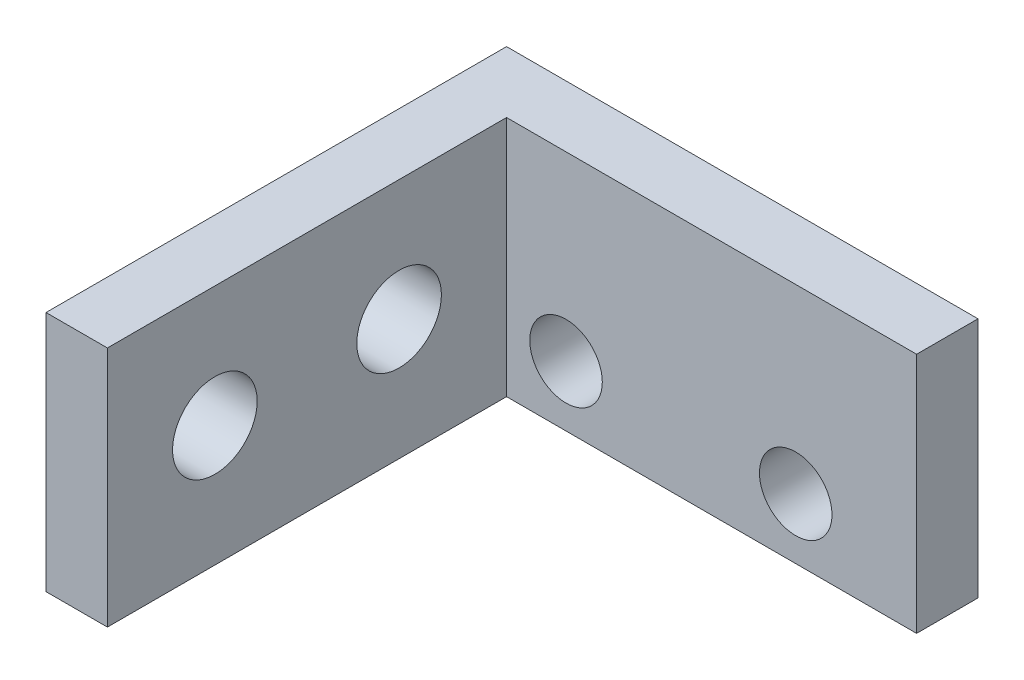
ISO-10303-21;
HEADER;
FILE_DESCRIPTION(('STEP AP214'),'2;1');
FILE_NAME('part.step','',(''),(''),'','','');
FILE_SCHEMA(('AUTOMOTIVE_DESIGN { 1 0 10303 214 1 1 1 1 }'));
ENDSEC;
DATA;
#1=APPLICATION_CONTEXT('core data for automotive mechanical design processes');
#2=APPLICATION_PROTOCOL_DEFINITION('international standard','automotive_design',2000,#1);
#3=PRODUCT_CONTEXT('',#1,'mechanical');
#4=PRODUCT('Part','Part','',(#3));
#5=PRODUCT_RELATED_PRODUCT_CATEGORY('part','',(#4));
#6=PRODUCT_DEFINITION_FORMATION('','',#4);
#7=PRODUCT_DEFINITION_CONTEXT('part definition',#1,'design');
#8=PRODUCT_DEFINITION('design','',#6,#7);
#9=PRODUCT_DEFINITION_SHAPE('','',#8);
#10=(LENGTH_UNIT() NAMED_UNIT(*) SI_UNIT(.MILLI.,.METRE.));
#11=(NAMED_UNIT(*) PLANE_ANGLE_UNIT() SI_UNIT($,.RADIAN.));
#12=(NAMED_UNIT(*) SI_UNIT($,.STERADIAN.) SOLID_ANGLE_UNIT());
#13=UNCERTAINTY_MEASURE_WITH_UNIT(LENGTH_MEASURE(1.E-05),#10,'distance_accuracy_value','');
#14=(GEOMETRIC_REPRESENTATION_CONTEXT(3) GLOBAL_UNCERTAINTY_ASSIGNED_CONTEXT((#13)) GLOBAL_UNIT_ASSIGNED_CONTEXT((#10,
#11,#12)) REPRESENTATION_CONTEXT('',''));
#15=CARTESIAN_POINT('',(0.,0.,0.));
#16=DIRECTION('',(0.,0.,1.));
#17=DIRECTION('',(1.,0.,0.));
#18=AXIS2_PLACEMENT_3D('',#15,#16,#17);
#19=CARTESIAN_POINT('',(0.,0.,1.27));
#20=DIRECTION('',(0.,0.,-1.));
#21=DIRECTION('',(-1.,0.,0.));
#22=AXIS2_PLACEMENT_3D('',#19,#20,#21);
#23=PLANE('',#22);
#24=DIRECTION('',(-1.,0.,0.));
#25=VECTOR('',#24,1.);
#26=CARTESIAN_POINT('',(-9.75,5.,1.27));
#27=LINE('',#26,#25);
#28=CARTESIAN_POINT('',(9.75,5.,1.27));
#29=VERTEX_POINT('',#28);
#30=CARTESIAN_POINT('',(-7.21,5.,1.27));
#31=VERTEX_POINT('',#30);
#32=EDGE_CURVE('E61',#29,#31,#27,.T.);
#33=ORIENTED_EDGE('',*,*,#32,.T.);
#34=DIRECTION('',(0.,-1.,0.));
#35=VECTOR('',#34,1.);
#36=CARTESIAN_POINT('',(-7.21,0.,1.27));
#37=LINE('',#36,#35);
#38=CARTESIAN_POINT('',(-7.21,-5.,1.27));
#39=VERTEX_POINT('',#38);
#40=EDGE_CURVE('E65',#31,#39,#37,.T.);
#41=ORIENTED_EDGE('',*,*,#40,.T.);
#42=DIRECTION('',(1.,0.,0.));
#43=VECTOR('',#42,1.);
#44=CARTESIAN_POINT('',(-9.75,-5.,1.27));
#45=LINE('',#44,#43);
#46=CARTESIAN_POINT('',(9.75,-5.,1.27));
#47=VERTEX_POINT('',#46);
#48=EDGE_CURVE('E104',#39,#47,#45,.T.);
#49=ORIENTED_EDGE('',*,*,#48,.T.);
#50=DIRECTION('',(0.,1.,0.));
#51=VECTOR('',#50,1.);
#52=CARTESIAN_POINT('',(9.75,-5.,1.27));
#53=LINE('',#52,#51);
#54=EDGE_CURVE('E153',#47,#29,#53,.T.);
#55=ORIENTED_EDGE('',*,*,#54,.T.);
#56=EDGE_LOOP('',(#33,#41,#49,#55));
#57=FACE_BOUND('',#56,.T.);
#58=CARTESIAN_POINT('',(-4.75,-2.5,1.27));
#59=DIRECTION('',(0.,0.,1.));
#60=DIRECTION('',(1.,0.,0.));
#61=AXIS2_PLACEMENT_3D('',#58,#59,#60);
#62=CIRCLE('',#61,1.5);
#63=CARTESIAN_POINT('',(-3.25,-2.5,1.27));
#64=VERTEX_POINT('',#63);
#65=EDGE_CURVE('E145',#64,#64,#62,.T.);
#66=ORIENTED_EDGE('',*,*,#65,.F.);
#67=EDGE_LOOP('',(#66));
#68=FACE_BOUND('',#67,.T.);
#69=CARTESIAN_POINT('',(4.75,-2.5,1.27));
#70=DIRECTION('',(0.,0.,1.));
#71=DIRECTION('',(1.,0.,0.));
#72=AXIS2_PLACEMENT_3D('',#69,#70,#71);
#73=CIRCLE('',#72,1.5);
#74=CARTESIAN_POINT('',(6.25,-2.5,1.27));
#75=VERTEX_POINT('',#74);
#76=EDGE_CURVE('E137',#75,#75,#73,.T.);
#77=ORIENTED_EDGE('',*,*,#76,.F.);
#78=EDGE_LOOP('',(#77));
#79=FACE_BOUND('',#78,.T.);
#80=ADVANCED_FACE('F45',(#57,#68,#79),#23,.F.);
#81=CARTESIAN_POINT('',(0.,0.,-1.27));
#82=DIRECTION('',(0.,0.,-1.));
#83=DIRECTION('',(-1.,0.,0.));
#84=AXIS2_PLACEMENT_3D('',#81,#82,#83);
#85=PLANE('',#84);
#86=DIRECTION('',(0.,1.,0.));
#87=VECTOR('',#86,1.);
#88=CARTESIAN_POINT('',(9.75,-5.,-1.27));
#89=LINE('',#88,#87);
#90=CARTESIAN_POINT('',(9.75,-5.,-1.27));
#91=VERTEX_POINT('',#90);
#92=CARTESIAN_POINT('',(9.75,5.,-1.27));
#93=VERTEX_POINT('',#92);
#94=EDGE_CURVE('E149',#91,#93,#89,.T.);
#95=ORIENTED_EDGE('',*,*,#94,.F.);
#96=DIRECTION('',(1.,0.,0.));
#97=VECTOR('',#96,1.);
#98=CARTESIAN_POINT('',(-9.75,-5.,-1.27));
#99=LINE('',#98,#97);
#100=CARTESIAN_POINT('',(-9.75,-5.,-1.27));
#101=VERTEX_POINT('',#100);
#102=EDGE_CURVE('E156',#101,#91,#99,.T.);
#103=ORIENTED_EDGE('',*,*,#102,.F.);
#104=DIRECTION('',(0.,-1.,0.));
#105=VECTOR('',#104,1.);
#106=CARTESIAN_POINT('',(-9.75,-5.,-1.27));
#107=LINE('',#106,#105);
#108=CARTESIAN_POINT('',(-9.75,5.,-1.27));
#109=VERTEX_POINT('',#108);
#110=EDGE_CURVE('E168',#109,#101,#107,.T.);
#111=ORIENTED_EDGE('',*,*,#110,.F.);
#112=DIRECTION('',(-1.,0.,0.));
#113=VECTOR('',#112,1.);
#114=CARTESIAN_POINT('',(-9.75,5.,-1.27));
#115=LINE('',#114,#113);
#116=EDGE_CURVE('E165',#93,#109,#115,.T.);
#117=ORIENTED_EDGE('',*,*,#116,.F.);
#118=EDGE_LOOP('',(#95,#103,#111,#117));
#119=FACE_BOUND('',#118,.T.);
#120=CARTESIAN_POINT('',(-4.75,-2.5,-1.27));
#121=DIRECTION('',(0.,0.,1.));
#122=DIRECTION('',(1.,0.,0.));
#123=AXIS2_PLACEMENT_3D('',#120,#121,#122);
#124=CIRCLE('',#123,1.5);
#125=CARTESIAN_POINT('',(-3.25,-2.5,-1.27));
#126=VERTEX_POINT('',#125);
#127=EDGE_CURVE('E141',#126,#126,#124,.T.);
#128=ORIENTED_EDGE('',*,*,#127,.T.);
#129=EDGE_LOOP('',(#128));
#130=FACE_BOUND('',#129,.T.);
#131=CARTESIAN_POINT('',(4.75,-2.5,-1.27));
#132=DIRECTION('',(0.,0.,1.));
#133=DIRECTION('',(1.,0.,0.));
#134=AXIS2_PLACEMENT_3D('',#131,#132,#133);
#135=CIRCLE('',#134,1.5);
#136=CARTESIAN_POINT('',(6.25,-2.5,-1.27));
#137=VERTEX_POINT('',#136);
#138=EDGE_CURVE('E136',#137,#137,#135,.T.);
#139=ORIENTED_EDGE('',*,*,#138,.T.);
#140=EDGE_LOOP('',(#139));
#141=FACE_BOUND('',#140,.T.);
#142=ADVANCED_FACE('F187',(#119,#130,#141),#85,.T.);
#143=CARTESIAN_POINT('',(9.75,-5.,1.27));
#144=DIRECTION('',(-1.,0.,0.));
#145=DIRECTION('',(0.,0.,1.));
#146=AXIS2_PLACEMENT_3D('',#143,#144,#145);
#147=PLANE('',#146);
#148=ORIENTED_EDGE('',*,*,#94,.T.);
#149=DIRECTION('',(0.,0.,-1.));
#150=VECTOR('',#149,1.);
#151=CARTESIAN_POINT('',(9.75,5.,1.27));
#152=LINE('',#151,#150);
#153=EDGE_CURVE('E11',#29,#93,#152,.T.);
#154=ORIENTED_EDGE('',*,*,#153,.F.);
#155=ORIENTED_EDGE('',*,*,#54,.F.);
#156=DIRECTION('',(0.,0.,-1.));
#157=VECTOR('',#156,1.);
#158=CARTESIAN_POINT('',(9.75,-5.,1.27));
#159=LINE('',#158,#157);
#160=EDGE_CURVE('E161',#47,#91,#159,.T.);
#161=ORIENTED_EDGE('',*,*,#160,.T.);
#162=EDGE_LOOP('',(#148,#154,#155,#161));
#163=FACE_BOUND('',#162,.T.);
#164=ADVANCED_FACE('F47',(#163),#147,.F.);
#165=CARTESIAN_POINT('',(-9.75,5.,1.27));
#166=DIRECTION('',(0.,-1.,0.));
#167=DIRECTION('',(0.,0.,-1.));
#168=AXIS2_PLACEMENT_3D('',#165,#166,#167);
#169=PLANE('',#168);
#170=ORIENTED_EDGE('',*,*,#116,.T.);
#171=DIRECTION('',(0.,0.,-1.));
#172=VECTOR('',#171,1.);
#173=CARTESIAN_POINT('',(-9.75,5.,1.27));
#174=LINE('',#173,#172);
#175=CARTESIAN_POINT('',(-9.75,5.,17.78));
#176=VERTEX_POINT('',#175);
#177=EDGE_CURVE('E54',#176,#109,#174,.T.);
#178=ORIENTED_EDGE('',*,*,#177,.F.);
#179=DIRECTION('',(-1.,0.,0.));
#180=VECTOR('',#179,1.);
#181=CARTESIAN_POINT('',(-7.21,5.,17.78));
#182=LINE('',#181,#180);
#183=CARTESIAN_POINT('',(-7.21,5.,17.78));
#184=VERTEX_POINT('',#183);
#185=EDGE_CURVE('E118',#184,#176,#182,.T.);
#186=ORIENTED_EDGE('',*,*,#185,.F.);
#187=DIRECTION('',(0.,0.,-1.));
#188=VECTOR('',#187,1.);
#189=CARTESIAN_POINT('',(-7.21,5.,-1.27));
#190=LINE('',#189,#188);
#191=EDGE_CURVE('E119',#184,#31,#190,.T.);
#192=ORIENTED_EDGE('',*,*,#191,.T.);
#193=ORIENTED_EDGE('',*,*,#32,.F.);
#194=ORIENTED_EDGE('',*,*,#153,.T.);
#195=EDGE_LOOP('',(#170,#178,#186,#192,#193,#194));
#196=FACE_BOUND('',#195,.T.);
#197=ADVANCED_FACE('F212',(#196),#169,.F.);
#198=CARTESIAN_POINT('',(-9.75,-5.,1.27));
#199=DIRECTION('',(1.,0.,0.));
#200=DIRECTION('',(0.,0.,-1.));
#201=AXIS2_PLACEMENT_3D('',#198,#199,#200);
#202=PLANE('',#201);
#203=CARTESIAN_POINT('',(-9.75,0.,5.715));
#204=DIRECTION('',(1.,0.,0.));
#205=DIRECTION('',(0.,0.,-1.));
#206=AXIS2_PLACEMENT_3D('',#203,#204,#205);
#207=CIRCLE('',#206,1.75);
#208=CARTESIAN_POINT('',(-9.75,0.,3.965));
#209=VERTEX_POINT('',#208);
#210=EDGE_CURVE('E131',#209,#209,#207,.T.);
#211=ORIENTED_EDGE('',*,*,#210,.T.);
#212=EDGE_LOOP('',(#211));
#213=FACE_BOUND('',#212,.T.);
#214=CARTESIAN_POINT('',(-9.75,0.,13.335));
#215=DIRECTION('',(1.,0.,0.));
#216=DIRECTION('',(0.,0.,-1.));
#217=AXIS2_PLACEMENT_3D('',#214,#215,#216);
#218=CIRCLE('',#217,1.75);
#219=CARTESIAN_POINT('',(-9.75,0.,11.585));
#220=VERTEX_POINT('',#219);
#221=EDGE_CURVE('E328',#220,#220,#218,.T.);
#222=ORIENTED_EDGE('',*,*,#221,.T.);
#223=EDGE_LOOP('',(#222));
#224=FACE_BOUND('',#223,.T.);
#225=ORIENTED_EDGE('',*,*,#110,.T.);
#226=DIRECTION('',(0.,0.,-1.));
#227=VECTOR('',#226,1.);
#228=CARTESIAN_POINT('',(-9.75,-5.,1.27));
#229=LINE('',#228,#227);
#230=CARTESIAN_POINT('',(-9.75,-5.,17.78));
#231=VERTEX_POINT('',#230);
#232=EDGE_CURVE('E176',#231,#101,#229,.T.);
#233=ORIENTED_EDGE('',*,*,#232,.F.);
#234=DIRECTION('',(0.,1.,0.));
#235=VECTOR('',#234,1.);
#236=CARTESIAN_POINT('',(-9.75,-5.,17.78));
#237=LINE('',#236,#235);
#238=EDGE_CURVE('E109',#231,#176,#237,.T.);
#239=ORIENTED_EDGE('',*,*,#238,.T.);
#240=ORIENTED_EDGE('',*,*,#177,.T.);
#241=EDGE_LOOP('',(#225,#233,#239,#240));
#242=FACE_BOUND('',#241,.T.);
#243=ADVANCED_FACE('F182',(#213,#224,#242),#202,.F.);
#244=CARTESIAN_POINT('',(-9.75,-5.,1.27));
#245=DIRECTION('',(0.,1.,0.));
#246=DIRECTION('',(0.,0.,1.));
#247=AXIS2_PLACEMENT_3D('',#244,#245,#246);
#248=PLANE('',#247);
#249=ORIENTED_EDGE('',*,*,#48,.F.);
#250=DIRECTION('',(0.,0.,1.));
#251=VECTOR('',#250,1.);
#252=CARTESIAN_POINT('',(-7.21,-5.,-1.27));
#253=LINE('',#252,#251);
#254=CARTESIAN_POINT('',(-7.21,-5.,17.78));
#255=VERTEX_POINT('',#254);
#256=EDGE_CURVE('E97',#39,#255,#253,.T.);
#257=ORIENTED_EDGE('',*,*,#256,.T.);
#258=DIRECTION('',(-1.,0.,0.));
#259=VECTOR('',#258,1.);
#260=CARTESIAN_POINT('',(-7.21,-5.,17.78));
#261=LINE('',#260,#259);
#262=EDGE_CURVE('E101',#255,#231,#261,.T.);
#263=ORIENTED_EDGE('',*,*,#262,.T.);
#264=ORIENTED_EDGE('',*,*,#232,.T.);
#265=ORIENTED_EDGE('',*,*,#102,.T.);
#266=ORIENTED_EDGE('',*,*,#160,.F.);
#267=EDGE_LOOP('',(#249,#257,#263,#264,#265,#266));
#268=FACE_BOUND('',#267,.T.);
#269=ADVANCED_FACE('F99',(#268),#248,.F.);
#270=CARTESIAN_POINT('',(-4.75,-2.5,1.27));
#271=DIRECTION('',(0.,0.,-1.));
#272=DIRECTION('',(-1.,0.,0.));
#273=AXIS2_PLACEMENT_3D('',#270,#271,#272);
#274=CYLINDRICAL_SURFACE('',#273,1.5);
#275=ORIENTED_EDGE('',*,*,#65,.T.);
#276=EDGE_LOOP('',(#275));
#277=FACE_BOUND('',#276,.T.);
#278=ORIENTED_EDGE('',*,*,#127,.F.);
#279=EDGE_LOOP('',(#278));
#280=FACE_BOUND('',#279,.T.);
#281=ADVANCED_FACE('F202',(#277,#280),#274,.F.);
#282=CARTESIAN_POINT('',(4.75,-2.5,1.27));
#283=DIRECTION('',(0.,0.,-1.));
#284=DIRECTION('',(-1.,0.,0.));
#285=AXIS2_PLACEMENT_3D('',#282,#283,#284);
#286=CYLINDRICAL_SURFACE('',#285,1.5);
#287=ORIENTED_EDGE('',*,*,#76,.T.);
#288=EDGE_LOOP('',(#287));
#289=FACE_BOUND('',#288,.T.);
#290=ORIENTED_EDGE('',*,*,#138,.F.);
#291=EDGE_LOOP('',(#290));
#292=FACE_BOUND('',#291,.T.);
#293=ADVANCED_FACE('F199',(#289,#292),#286,.F.);
#294=CARTESIAN_POINT('',(-7.21,0.,0.));
#295=DIRECTION('',(1.,0.,0.));
#296=DIRECTION('',(0.,0.,-1.));
#297=AXIS2_PLACEMENT_3D('',#294,#295,#296);
#298=PLANE('',#297);
#299=CARTESIAN_POINT('',(-7.21,0.,5.715));
#300=DIRECTION('',(1.,0.,0.));
#301=DIRECTION('',(0.,0.,-1.));
#302=AXIS2_PLACEMENT_3D('',#299,#300,#301);
#303=CIRCLE('',#302,1.75);
#304=CARTESIAN_POINT('',(-7.21,0.,3.965));
#305=VERTEX_POINT('',#304);
#306=EDGE_CURVE('E320',#305,#305,#303,.T.);
#307=ORIENTED_EDGE('',*,*,#306,.F.);
#308=EDGE_LOOP('',(#307));
#309=FACE_BOUND('',#308,.T.);
#310=CARTESIAN_POINT('',(-7.21,0.,13.335));
#311=DIRECTION('',(1.,0.,0.));
#312=DIRECTION('',(0.,0.,-1.));
#313=AXIS2_PLACEMENT_3D('',#310,#311,#312);
#314=CIRCLE('',#313,1.75);
#315=CARTESIAN_POINT('',(-7.21,0.,11.585));
#316=VERTEX_POINT('',#315);
#317=EDGE_CURVE('E322',#316,#316,#314,.T.);
#318=ORIENTED_EDGE('',*,*,#317,.F.);
#319=EDGE_LOOP('',(#318));
#320=FACE_BOUND('',#319,.T.);
#321=ORIENTED_EDGE('',*,*,#40,.F.);
#322=ORIENTED_EDGE('',*,*,#191,.F.);
#323=DIRECTION('',(0.,1.,0.));
#324=VECTOR('',#323,1.);
#325=CARTESIAN_POINT('',(-7.21,-5.,17.78));
#326=LINE('',#325,#324);
#327=EDGE_CURVE('E108',#255,#184,#326,.T.);
#328=ORIENTED_EDGE('',*,*,#327,.F.);
#329=ORIENTED_EDGE('',*,*,#256,.F.);
#330=EDGE_LOOP('',(#321,#322,#328,#329));
#331=FACE_BOUND('',#330,.T.);
#332=ADVANCED_FACE('F121',(#309,#320,#331),#298,.T.);
#333=CARTESIAN_POINT('',(-7.21,-5.,17.78));
#334=DIRECTION('',(0.,0.,1.));
#335=DIRECTION('',(1.,0.,0.));
#336=AXIS2_PLACEMENT_3D('',#333,#334,#335);
#337=PLANE('',#336);
#338=ORIENTED_EDGE('',*,*,#238,.F.);
#339=ORIENTED_EDGE('',*,*,#262,.F.);
#340=ORIENTED_EDGE('',*,*,#327,.T.);
#341=ORIENTED_EDGE('',*,*,#185,.T.);
#342=EDGE_LOOP('',(#338,#339,#340,#341));
#343=FACE_BOUND('',#342,.T.);
#344=ADVANCED_FACE('F113',(#343),#337,.T.);
#345=CARTESIAN_POINT('',(-9.75,0.,13.335));
#346=DIRECTION('',(1.,0.,0.));
#347=DIRECTION('',(0.,0.,-1.));
#348=AXIS2_PLACEMENT_3D('',#345,#346,#347);
#349=CYLINDRICAL_SURFACE('',#348,1.75);
#350=ORIENTED_EDGE('',*,*,#221,.F.);
#351=EDGE_LOOP('',(#350));
#352=FACE_BOUND('',#351,.T.);
#353=ORIENTED_EDGE('',*,*,#317,.T.);
#354=EDGE_LOOP('',(#353));
#355=FACE_BOUND('',#354,.T.);
#356=ADVANCED_FACE('F235',(#352,#355),#349,.F.);
#357=CARTESIAN_POINT('',(-9.75,0.,5.715));
#358=DIRECTION('',(1.,0.,0.));
#359=DIRECTION('',(0.,0.,-1.));
#360=AXIS2_PLACEMENT_3D('',#357,#358,#359);
#361=CYLINDRICAL_SURFACE('',#360,1.75);
#362=ORIENTED_EDGE('',*,*,#210,.F.);
#363=EDGE_LOOP('',(#362));
#364=FACE_BOUND('',#363,.T.);
#365=ORIENTED_EDGE('',*,*,#306,.T.);
#366=EDGE_LOOP('',(#365));
#367=FACE_BOUND('',#366,.T.);
#368=ADVANCED_FACE('F255',(#364,#367),#361,.F.);
#369=CLOSED_SHELL('',(#80,#142,#164,#197,#243,#269,#281,#293,#332,#344,#356,#368));
#370=MANIFOLD_SOLID_BREP('B2',#369);
#371=ADVANCED_BREP_SHAPE_REPRESENTATION('',(#18,#370),#14);
#372=SHAPE_DEFINITION_REPRESENTATION(#9,#371);
ENDSEC;
END-ISO-10303-21;
